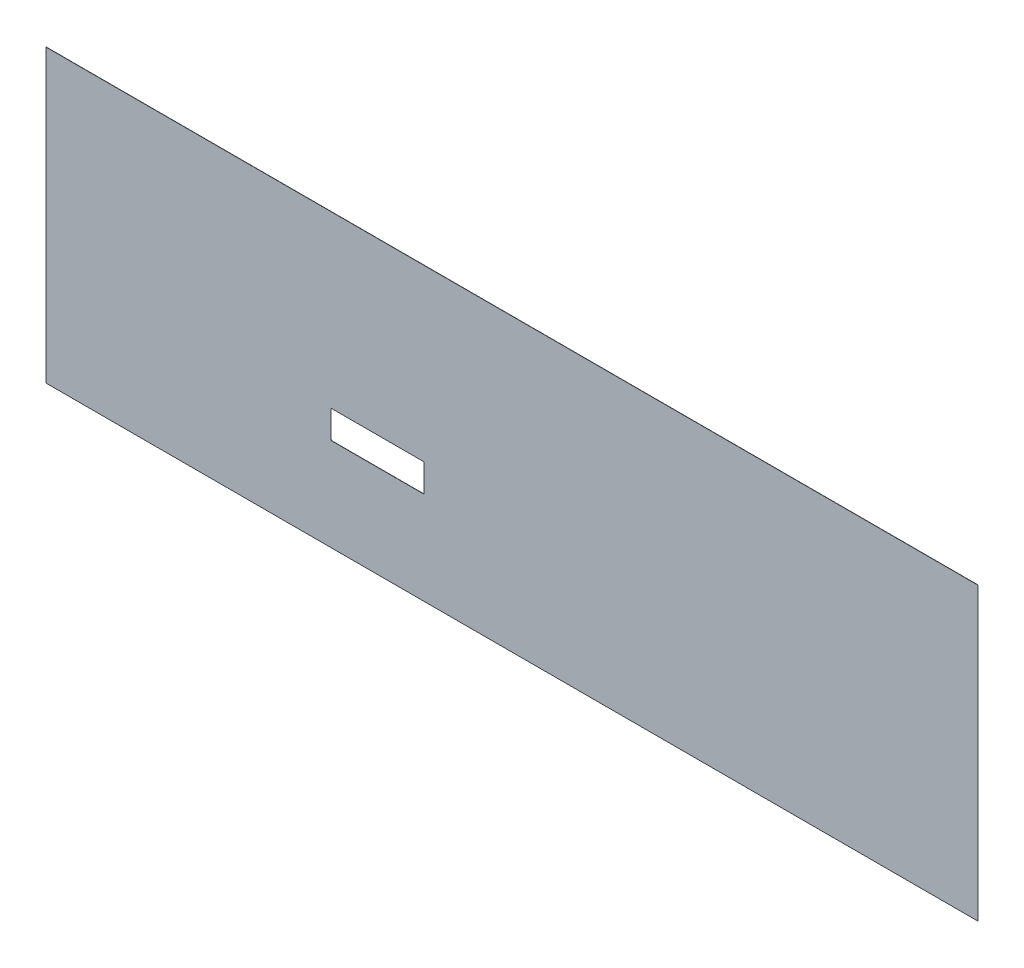
ISO-10303-21;
HEADER;
FILE_DESCRIPTION(('STEP AP214'),'2;1');
FILE_NAME('part.step','',(''),(''),'','','');
FILE_SCHEMA(('AUTOMOTIVE_DESIGN { 1 0 10303 214 1 1 1 1 }'));
ENDSEC;
DATA;
#1=APPLICATION_CONTEXT('core data for automotive mechanical design processes');
#2=APPLICATION_PROTOCOL_DEFINITION('international standard','automotive_design',2000,#1);
#3=PRODUCT_CONTEXT('',#1,'mechanical');
#4=PRODUCT('Part','Part','',(#3));
#5=PRODUCT_RELATED_PRODUCT_CATEGORY('part','',(#4));
#6=PRODUCT_DEFINITION_FORMATION('','',#4);
#7=PRODUCT_DEFINITION_CONTEXT('part definition',#1,'design');
#8=PRODUCT_DEFINITION('design','',#6,#7);
#9=PRODUCT_DEFINITION_SHAPE('','',#8);
#10=(LENGTH_UNIT() NAMED_UNIT(*) SI_UNIT(.MILLI.,.METRE.));
#11=(NAMED_UNIT(*) PLANE_ANGLE_UNIT() SI_UNIT($,.RADIAN.));
#12=(NAMED_UNIT(*) SI_UNIT($,.STERADIAN.) SOLID_ANGLE_UNIT());
#13=UNCERTAINTY_MEASURE_WITH_UNIT(LENGTH_MEASURE(1.E-05),#10,'distance_accuracy_value','');
#14=(GEOMETRIC_REPRESENTATION_CONTEXT(3) GLOBAL_UNCERTAINTY_ASSIGNED_CONTEXT((#13)) GLOBAL_UNIT_ASSIGNED_CONTEXT((#10,
#11,#12)) REPRESENTATION_CONTEXT('',''));
#15=CARTESIAN_POINT('',(0.,0.,0.));
#16=DIRECTION('',(0.,0.,1.));
#17=DIRECTION('',(1.,0.,0.));
#18=AXIS2_PLACEMENT_3D('',#15,#16,#17);
#19=CARTESIAN_POINT('',(1082.675,822.35675,-14927.8169262266));
#20=DIRECTION('',(0.,0.,1.));
#21=DIRECTION('',(1.,0.,0.));
#22=AXIS2_PLACEMENT_3D('',#19,#20,#21);
#23=CYLINDRICAL_SURFACE('',#22,6.34999999999991);
#24=CARTESIAN_POINT('',(1082.675,822.35675,-8281.9875));
#25=DIRECTION('',(0.,0.,-1.));
#26=DIRECTION('',(-1.,0.,0.));
#27=AXIS2_PLACEMENT_3D('',#24,#25,#26);
#28=CIRCLE('',#27,6.34999999999991);
#29=CARTESIAN_POINT('',(1082.675,828.70675,-8281.9875));
#30=VERTEX_POINT('',#29);
#31=CARTESIAN_POINT('',(1076.325,822.35675,-8281.9875));
#32=VERTEX_POINT('',#31);
#33=EDGE_CURVE('E137',#30,#32,#28,.F.);
#34=ORIENTED_EDGE('',*,*,#33,.F.);
#35=DIRECTION('',(0.,0.,1.));
#36=VECTOR('',#35,1.);
#37=CARTESIAN_POINT('',(1082.675,828.70675,-14927.8169262266));
#38=LINE('',#37,#36);
#39=CARTESIAN_POINT('',(1082.675,828.70675,-8280.4));
#40=VERTEX_POINT('',#39);
#41=EDGE_CURVE('E133',#30,#40,#38,.T.);
#42=ORIENTED_EDGE('',*,*,#41,.T.);
#43=CARTESIAN_POINT('',(1082.675,822.35675,-8280.4));
#44=DIRECTION('',(0.,0.,1.));
#45=DIRECTION('',(1.,0.,0.));
#46=AXIS2_PLACEMENT_3D('',#43,#44,#45);
#47=CIRCLE('',#46,6.34999999999991);
#48=CARTESIAN_POINT('',(1076.325,822.35675,-8280.4));
#49=VERTEX_POINT('',#48);
#50=EDGE_CURVE('E172',#40,#49,#47,.T.);
#51=ORIENTED_EDGE('',*,*,#50,.T.);
#52=DIRECTION('',(0.,0.,1.));
#53=VECTOR('',#52,1.);
#54=CARTESIAN_POINT('',(1076.325,822.35675,-14927.8169262266));
#55=LINE('',#54,#53);
#56=EDGE_CURVE('E169',#32,#49,#55,.T.);
#57=ORIENTED_EDGE('',*,*,#56,.F.);
#58=EDGE_LOOP('',(#34,#42,#51,#57));
#59=FACE_BOUND('',#58,.T.);
#60=ADVANCED_FACE('F32',(#59),#23,.F.);
#61=CARTESIAN_POINT('',(1076.325,0.,-14927.8169262266));
#62=DIRECTION('',(-1.,0.,0.));
#63=DIRECTION('',(0.,0.,1.));
#64=AXIS2_PLACEMENT_3D('',#61,#62,#63);
#65=PLANE('',#64);
#66=DIRECTION('',(0.,-1.,0.));
#67=VECTOR('',#66,1.);
#68=CARTESIAN_POINT('',(1076.325,0.,-8281.9875));
#69=LINE('',#68,#67);
#70=CARTESIAN_POINT('',(1076.325,644.55675,-8281.9875));
#71=VERTEX_POINT('',#70);
#72=EDGE_CURVE('E155',#32,#71,#69,.T.);
#73=ORIENTED_EDGE('',*,*,#72,.F.);
#74=ORIENTED_EDGE('',*,*,#56,.T.);
#75=DIRECTION('',(0.,-1.,0.));
#76=VECTOR('',#75,1.);
#77=CARTESIAN_POINT('',(1076.325,0.,-8280.4));
#78=LINE('',#77,#76);
#79=CARTESIAN_POINT('',(1076.325,644.55675,-8280.4));
#80=VERTEX_POINT('',#79);
#81=EDGE_CURVE('E171',#49,#80,#78,.T.);
#82=ORIENTED_EDGE('',*,*,#81,.T.);
#83=DIRECTION('',(0.,0.,1.));
#84=VECTOR('',#83,1.);
#85=CARTESIAN_POINT('',(1076.325,644.55675,-14927.8169262266));
#86=LINE('',#85,#84);
#87=EDGE_CURVE('E173',#71,#80,#86,.T.);
#88=ORIENTED_EDGE('',*,*,#87,.F.);
#89=EDGE_LOOP('',(#73,#74,#82,#88));
#90=FACE_BOUND('',#89,.T.);
#91=ADVANCED_FACE('F223',(#90),#65,.F.);
#92=CARTESIAN_POINT('',(1082.675,644.55675,-14927.8169262266));
#93=DIRECTION('',(0.,0.,1.));
#94=DIRECTION('',(1.,0.,0.));
#95=AXIS2_PLACEMENT_3D('',#92,#93,#94);
#96=CYLINDRICAL_SURFACE('',#95,6.34999999999991);
#97=CARTESIAN_POINT('',(1082.675,644.55675,-8281.9875));
#98=DIRECTION('',(0.,0.,-1.));
#99=DIRECTION('',(-1.,0.,0.));
#100=AXIS2_PLACEMENT_3D('',#97,#98,#99);
#101=CIRCLE('',#100,6.34999999999991);
#102=CARTESIAN_POINT('',(1082.675,638.20675,-8281.9875));
#103=VERTEX_POINT('',#102);
#104=EDGE_CURVE('E152',#71,#103,#101,.F.);
#105=ORIENTED_EDGE('',*,*,#104,.F.);
#106=ORIENTED_EDGE('',*,*,#87,.T.);
#107=CARTESIAN_POINT('',(1082.675,644.55675,-8280.4));
#108=DIRECTION('',(0.,0.,1.));
#109=DIRECTION('',(1.,0.,0.));
#110=AXIS2_PLACEMENT_3D('',#107,#108,#109);
#111=CIRCLE('',#110,6.34999999999991);
#112=CARTESIAN_POINT('',(1082.675,638.20675,-8280.4));
#113=VERTEX_POINT('',#112);
#114=EDGE_CURVE('E175',#80,#113,#111,.T.);
#115=ORIENTED_EDGE('',*,*,#114,.T.);
#116=DIRECTION('',(0.,0.,1.));
#117=VECTOR('',#116,1.);
#118=CARTESIAN_POINT('',(1082.675,638.20675,-14927.8169262266));
#119=LINE('',#118,#117);
#120=EDGE_CURVE('E176',#103,#113,#119,.T.);
#121=ORIENTED_EDGE('',*,*,#120,.F.);
#122=EDGE_LOOP('',(#105,#106,#115,#121));
#123=FACE_BOUND('',#122,.T.);
#124=ADVANCED_FACE('F232',(#123),#96,.F.);
#125=CARTESIAN_POINT('',(1.13860168459134E-13,638.20675,-14927.8169262266));
#126=DIRECTION('',(0.,-1.,0.));
#127=DIRECTION('',(1.,0.,0.));
#128=AXIS2_PLACEMENT_3D('',#125,#126,#127);
#129=PLANE('',#128);
#130=DIRECTION('',(1.,0.,0.));
#131=VECTOR('',#130,1.);
#132=CARTESIAN_POINT('',(1.13860168459134E-13,638.20675,-8281.9875));
#133=LINE('',#132,#131);
#134=CARTESIAN_POINT('',(1704.975,638.20675,-8281.9875));
#135=VERTEX_POINT('',#134);
#136=EDGE_CURVE('E147',#103,#135,#133,.T.);
#137=ORIENTED_EDGE('',*,*,#136,.F.);
#138=ORIENTED_EDGE('',*,*,#120,.T.);
#139=DIRECTION('',(1.,0.,0.));
#140=VECTOR('',#139,1.);
#141=CARTESIAN_POINT('',(1.13860168459134E-13,638.20675,-8280.4));
#142=LINE('',#141,#140);
#143=CARTESIAN_POINT('',(1704.975,638.20675,-8280.4));
#144=VERTEX_POINT('',#143);
#145=EDGE_CURVE('E178',#113,#144,#142,.T.);
#146=ORIENTED_EDGE('',*,*,#145,.T.);
#147=DIRECTION('',(0.,0.,1.));
#148=VECTOR('',#147,1.);
#149=CARTESIAN_POINT('',(1704.975,638.20675,-14927.8169262266));
#150=LINE('',#149,#148);
#151=EDGE_CURVE('E179',#135,#144,#150,.T.);
#152=ORIENTED_EDGE('',*,*,#151,.F.);
#153=EDGE_LOOP('',(#137,#138,#146,#152));
#154=FACE_BOUND('',#153,.T.);
#155=ADVANCED_FACE('F240',(#154),#129,.F.);
#156=CARTESIAN_POINT('',(1704.975,644.55675,-14927.8169262266));
#157=DIRECTION('',(0.,0.,1.));
#158=DIRECTION('',(1.,0.,0.));
#159=AXIS2_PLACEMENT_3D('',#156,#157,#158);
#160=CYLINDRICAL_SURFACE('',#159,6.34999999999997);
#161=CARTESIAN_POINT('',(1704.975,644.55675,-8281.9875));
#162=DIRECTION('',(0.,0.,-1.));
#163=DIRECTION('',(-1.,0.,0.));
#164=AXIS2_PLACEMENT_3D('',#161,#162,#163);
#165=CIRCLE('',#164,6.34999999999997);
#166=CARTESIAN_POINT('',(1711.325,644.55675,-8281.9875));
#167=VERTEX_POINT('',#166);
#168=EDGE_CURVE('E143',#135,#167,#165,.F.);
#169=ORIENTED_EDGE('',*,*,#168,.F.);
#170=ORIENTED_EDGE('',*,*,#151,.T.);
#171=CARTESIAN_POINT('',(1704.975,644.55675,-8280.4));
#172=DIRECTION('',(0.,0.,1.));
#173=DIRECTION('',(1.,0.,0.));
#174=AXIS2_PLACEMENT_3D('',#171,#172,#173);
#175=CIRCLE('',#174,6.34999999999997);
#176=CARTESIAN_POINT('',(1711.325,644.55675,-8280.4));
#177=VERTEX_POINT('',#176);
#178=EDGE_CURVE('E181',#144,#177,#175,.T.);
#179=ORIENTED_EDGE('',*,*,#178,.T.);
#180=DIRECTION('',(0.,0.,1.));
#181=VECTOR('',#180,1.);
#182=CARTESIAN_POINT('',(1711.325,644.55675,-14927.8169262266));
#183=LINE('',#182,#181);
#184=EDGE_CURVE('E182',#167,#177,#183,.T.);
#185=ORIENTED_EDGE('',*,*,#184,.F.);
#186=EDGE_LOOP('',(#169,#170,#179,#185));
#187=FACE_BOUND('',#186,.T.);
#188=ADVANCED_FACE('F237',(#187),#160,.F.);
#189=CARTESIAN_POINT('',(1711.325,0.,-14927.8169262266));
#190=DIRECTION('',(1.,0.,0.));
#191=DIRECTION('',(0.,0.,-1.));
#192=AXIS2_PLACEMENT_3D('',#189,#190,#191);
#193=PLANE('',#192);
#194=DIRECTION('',(0.,1.,0.));
#195=VECTOR('',#194,1.);
#196=CARTESIAN_POINT('',(1711.325,0.,-8281.9875));
#197=LINE('',#196,#195);
#198=CARTESIAN_POINT('',(1711.325,822.35675,-8281.9875));
#199=VERTEX_POINT('',#198);
#200=EDGE_CURVE('E42',#167,#199,#197,.T.);
#201=ORIENTED_EDGE('',*,*,#200,.F.);
#202=ORIENTED_EDGE('',*,*,#184,.T.);
#203=DIRECTION('',(0.,1.,0.));
#204=VECTOR('',#203,1.);
#205=CARTESIAN_POINT('',(1711.325,0.,-8280.4));
#206=LINE('',#205,#204);
#207=CARTESIAN_POINT('',(1711.325,822.35675,-8280.4));
#208=VERTEX_POINT('',#207);
#209=EDGE_CURVE('E184',#177,#208,#206,.T.);
#210=ORIENTED_EDGE('',*,*,#209,.T.);
#211=DIRECTION('',(0.,0.,1.));
#212=VECTOR('',#211,1.);
#213=CARTESIAN_POINT('',(1711.325,822.35675,-14927.8169262266));
#214=LINE('',#213,#212);
#215=EDGE_CURVE('E185',#199,#208,#214,.T.);
#216=ORIENTED_EDGE('',*,*,#215,.F.);
#217=EDGE_LOOP('',(#201,#202,#210,#216));
#218=FACE_BOUND('',#217,.T.);
#219=ADVANCED_FACE('F235',(#218),#193,.F.);
#220=CARTESIAN_POINT('',(1704.975,822.35675,-14927.8169262266));
#221=DIRECTION('',(0.,0.,1.));
#222=DIRECTION('',(1.,0.,0.));
#223=AXIS2_PLACEMENT_3D('',#220,#221,#222);
#224=CYLINDRICAL_SURFACE('',#223,6.34999999999986);
#225=CARTESIAN_POINT('',(1704.975,822.35675,-8281.9875));
#226=DIRECTION('',(0.,0.,-1.));
#227=DIRECTION('',(-1.,0.,0.));
#228=AXIS2_PLACEMENT_3D('',#225,#226,#227);
#229=CIRCLE('',#228,6.34999999999986);
#230=CARTESIAN_POINT('',(1704.975,828.70675,-8281.9875));
#231=VERTEX_POINT('',#230);
#232=EDGE_CURVE('E11',#199,#231,#229,.F.);
#233=ORIENTED_EDGE('',*,*,#232,.F.);
#234=ORIENTED_EDGE('',*,*,#215,.T.);
#235=CARTESIAN_POINT('',(1704.975,822.35675,-8280.4));
#236=DIRECTION('',(0.,0.,1.));
#237=DIRECTION('',(1.,0.,0.));
#238=AXIS2_PLACEMENT_3D('',#235,#236,#237);
#239=CIRCLE('',#238,6.34999999999986);
#240=CARTESIAN_POINT('',(1704.975,828.70675,-8280.4));
#241=VERTEX_POINT('',#240);
#242=EDGE_CURVE('E122',#208,#241,#239,.T.);
#243=ORIENTED_EDGE('',*,*,#242,.T.);
#244=DIRECTION('',(0.,0.,1.));
#245=VECTOR('',#244,1.);
#246=CARTESIAN_POINT('',(1704.975,828.70675,-14927.8169262266));
#247=LINE('',#246,#245);
#248=EDGE_CURVE('E117',#231,#241,#247,.T.);
#249=ORIENTED_EDGE('',*,*,#248,.F.);
#250=EDGE_LOOP('',(#233,#234,#243,#249));
#251=FACE_BOUND('',#250,.T.);
#252=ADVANCED_FACE('F119',(#251),#224,.F.);
#253=CARTESIAN_POINT('',(0.,6.38175,-14927.8169262266));
#254=DIRECTION('',(0.,-1.,0.));
#255=DIRECTION('',(0.,0.,-1.));
#256=AXIS2_PLACEMENT_3D('',#253,#254,#255);
#257=PLANE('',#256);
#258=DIRECTION('',(0.,0.,1.));
#259=VECTOR('',#258,1.);
#260=CARTESIAN_POINT('',(-863.6,6.38175,-14927.8169262266));
#261=LINE('',#260,#259);
#262=CARTESIAN_POINT('',(-863.6,6.38175,-8281.9875));
#263=VERTEX_POINT('',#262);
#264=CARTESIAN_POINT('',(-863.6,6.38175,-8280.4));
#265=VERTEX_POINT('',#264);
#266=EDGE_CURVE('E164',#263,#265,#261,.T.);
#267=ORIENTED_EDGE('',*,*,#266,.F.);
#268=DIRECTION('',(1.,0.,0.));
#269=VECTOR('',#268,1.);
#270=CARTESIAN_POINT('',(0.,6.38175,-8281.9875));
#271=LINE('',#270,#269);
#272=CARTESIAN_POINT('',(5480.05,6.38175,-8281.9875));
#273=VERTEX_POINT('',#272);
#274=EDGE_CURVE('E159',#263,#273,#271,.T.);
#275=ORIENTED_EDGE('',*,*,#274,.T.);
#276=DIRECTION('',(0.,0.,1.));
#277=VECTOR('',#276,1.);
#278=CARTESIAN_POINT('',(5480.05,6.38175,-14927.8169262266));
#279=LINE('',#278,#277);
#280=CARTESIAN_POINT('',(5480.05,6.38175,-8280.4));
#281=VERTEX_POINT('',#280);
#282=EDGE_CURVE('E36',#273,#281,#279,.T.);
#283=ORIENTED_EDGE('',*,*,#282,.T.);
#284=DIRECTION('',(1.,0.,0.));
#285=VECTOR('',#284,1.);
#286=CARTESIAN_POINT('',(0.,6.38175,-8280.4));
#287=LINE('',#286,#285);
#288=EDGE_CURVE('E195',#265,#281,#287,.T.);
#289=ORIENTED_EDGE('',*,*,#288,.F.);
#290=EDGE_LOOP('',(#267,#275,#283,#289));
#291=FACE_BOUND('',#290,.T.);
#292=ADVANCED_FACE('F287',(#291),#257,.T.);
#293=CARTESIAN_POINT('',(-863.6,0.,-14927.8169262266));
#294=DIRECTION('',(-1.,0.,0.));
#295=DIRECTION('',(0.,0.,1.));
#296=AXIS2_PLACEMENT_3D('',#293,#294,#295);
#297=PLANE('',#296);
#298=DIRECTION('',(0.,0.,1.));
#299=VECTOR('',#298,1.);
#300=CARTESIAN_POINT('',(-863.6,1987.58175,-14927.8169262266));
#301=LINE('',#300,#299);
#302=CARTESIAN_POINT('',(-863.6,1987.58175,-8281.9875));
#303=VERTEX_POINT('',#302);
#304=CARTESIAN_POINT('',(-863.6,1987.58175,-8280.4));
#305=VERTEX_POINT('',#304);
#306=EDGE_CURVE('E167',#303,#305,#301,.T.);
#307=ORIENTED_EDGE('',*,*,#306,.F.);
#308=DIRECTION('',(0.,-1.,0.));
#309=VECTOR('',#308,1.);
#310=CARTESIAN_POINT('',(-863.6,0.,-8281.9875));
#311=LINE('',#310,#309);
#312=EDGE_CURVE('E161',#303,#263,#311,.T.);
#313=ORIENTED_EDGE('',*,*,#312,.T.);
#314=ORIENTED_EDGE('',*,*,#266,.T.);
#315=DIRECTION('',(0.,-1.,0.));
#316=VECTOR('',#315,1.);
#317=CARTESIAN_POINT('',(-863.6,0.,-8280.4));
#318=LINE('',#317,#316);
#319=EDGE_CURVE('E138',#305,#265,#318,.T.);
#320=ORIENTED_EDGE('',*,*,#319,.F.);
#321=EDGE_LOOP('',(#307,#313,#314,#320));
#322=FACE_BOUND('',#321,.T.);
#323=ADVANCED_FACE('F297',(#322),#297,.T.);
#324=CARTESIAN_POINT('',(0.,1987.58175,-14927.8169262266));
#325=DIRECTION('',(0.,1.,0.));
#326=DIRECTION('',(0.,0.,1.));
#327=AXIS2_PLACEMENT_3D('',#324,#325,#326);
#328=PLANE('',#327);
#329=DIRECTION('',(0.,0.,1.));
#330=VECTOR('',#329,1.);
#331=CARTESIAN_POINT('',(5480.05,1987.58175,-14927.8169262266));
#332=LINE('',#331,#330);
#333=CARTESIAN_POINT('',(5480.05,1987.58175,-8281.9875));
#334=VERTEX_POINT('',#333);
#335=CARTESIAN_POINT('',(5480.05,1987.58175,-8280.4));
#336=VERTEX_POINT('',#335);
#337=EDGE_CURVE('E127',#334,#336,#332,.T.);
#338=ORIENTED_EDGE('',*,*,#337,.F.);
#339=DIRECTION('',(-1.,0.,0.));
#340=VECTOR('',#339,1.);
#341=CARTESIAN_POINT('',(0.,1987.58175,-8281.9875));
#342=LINE('',#341,#340);
#343=EDGE_CURVE('E165',#334,#303,#342,.T.);
#344=ORIENTED_EDGE('',*,*,#343,.T.);
#345=ORIENTED_EDGE('',*,*,#306,.T.);
#346=DIRECTION('',(-1.,0.,0.));
#347=VECTOR('',#346,1.);
#348=CARTESIAN_POINT('',(0.,1987.58175,-8280.4));
#349=LINE('',#348,#347);
#350=EDGE_CURVE('E201',#336,#305,#349,.T.);
#351=ORIENTED_EDGE('',*,*,#350,.F.);
#352=EDGE_LOOP('',(#338,#344,#345,#351));
#353=FACE_BOUND('',#352,.T.);
#354=ADVANCED_FACE('F309',(#353),#328,.T.);
#355=CARTESIAN_POINT('',(5480.05,0.,-14927.8169262266));
#356=DIRECTION('',(1.,0.,0.));
#357=DIRECTION('',(0.,0.,-1.));
#358=AXIS2_PLACEMENT_3D('',#355,#356,#357);
#359=PLANE('',#358);
#360=ORIENTED_EDGE('',*,*,#282,.F.);
#361=DIRECTION('',(0.,1.,0.));
#362=VECTOR('',#361,1.);
#363=CARTESIAN_POINT('',(5480.05,0.,-8281.9875));
#364=LINE('',#363,#362);
#365=EDGE_CURVE('E50',#273,#334,#364,.T.);
#366=ORIENTED_EDGE('',*,*,#365,.T.);
#367=ORIENTED_EDGE('',*,*,#337,.T.);
#368=DIRECTION('',(0.,1.,0.));
#369=VECTOR('',#368,1.);
#370=CARTESIAN_POINT('',(5480.05,0.,-8280.4));
#371=LINE('',#370,#369);
#372=EDGE_CURVE('E198',#281,#336,#371,.T.);
#373=ORIENTED_EDGE('',*,*,#372,.F.);
#374=EDGE_LOOP('',(#360,#366,#367,#373));
#375=FACE_BOUND('',#374,.T.);
#376=ADVANCED_FACE('F320',(#375),#359,.T.);
#377=CARTESIAN_POINT('',(1.47846587580312E-13,828.70675,-14927.8169262266));
#378=DIRECTION('',(0.,1.,0.));
#379=DIRECTION('',(-1.,0.,0.));
#380=AXIS2_PLACEMENT_3D('',#377,#378,#379);
#381=PLANE('',#380);
#382=DIRECTION('',(-1.,0.,0.));
#383=VECTOR('',#382,1.);
#384=CARTESIAN_POINT('',(1.47846587580312E-13,828.70675,-8281.9875));
#385=LINE('',#384,#383);
#386=EDGE_CURVE('E131',#231,#30,#385,.T.);
#387=ORIENTED_EDGE('',*,*,#386,.F.);
#388=ORIENTED_EDGE('',*,*,#248,.T.);
#389=DIRECTION('',(-1.,0.,0.));
#390=VECTOR('',#389,1.);
#391=CARTESIAN_POINT('',(1.47846587580312E-13,828.70675,-8280.4));
#392=LINE('',#391,#390);
#393=EDGE_CURVE('E126',#241,#40,#392,.T.);
#394=ORIENTED_EDGE('',*,*,#393,.T.);
#395=ORIENTED_EDGE('',*,*,#41,.F.);
#396=EDGE_LOOP('',(#387,#388,#394,#395));
#397=FACE_BOUND('',#396,.T.);
#398=ADVANCED_FACE('F132',(#397),#381,.F.);
#399=CARTESIAN_POINT('',(0.,0.,-8280.4));
#400=DIRECTION('',(0.,0.,1.));
#401=DIRECTION('',(1.,0.,0.));
#402=AXIS2_PLACEMENT_3D('',#399,#400,#401);
#403=PLANE('',#402);
#404=ORIENTED_EDGE('',*,*,#288,.T.);
#405=ORIENTED_EDGE('',*,*,#372,.T.);
#406=ORIENTED_EDGE('',*,*,#350,.T.);
#407=ORIENTED_EDGE('',*,*,#319,.T.);
#408=EDGE_LOOP('',(#404,#405,#406,#407));
#409=FACE_BOUND('',#408,.T.);
#410=ORIENTED_EDGE('',*,*,#50,.F.);
#411=ORIENTED_EDGE('',*,*,#393,.F.);
#412=ORIENTED_EDGE('',*,*,#242,.F.);
#413=ORIENTED_EDGE('',*,*,#209,.F.);
#414=ORIENTED_EDGE('',*,*,#178,.F.);
#415=ORIENTED_EDGE('',*,*,#145,.F.);
#416=ORIENTED_EDGE('',*,*,#114,.F.);
#417=ORIENTED_EDGE('',*,*,#81,.F.);
#418=EDGE_LOOP('',(#410,#411,#412,#413,#414,#415,#416,#417));
#419=FACE_BOUND('',#418,.T.);
#420=ADVANCED_FACE('F228',(#409,#419),#403,.T.);
#421=CARTESIAN_POINT('',(5467.35,923.95675,-8281.9875));
#422=DIRECTION('',(0.,0.,-1.));
#423=DIRECTION('',(-1.,0.,0.));
#424=AXIS2_PLACEMENT_3D('',#421,#422,#423);
#425=PLANE('',#424);
#426=ORIENTED_EDGE('',*,*,#274,.F.);
#427=ORIENTED_EDGE('',*,*,#312,.F.);
#428=ORIENTED_EDGE('',*,*,#343,.F.);
#429=ORIENTED_EDGE('',*,*,#365,.F.);
#430=EDGE_LOOP('',(#426,#427,#428,#429));
#431=FACE_BOUND('',#430,.T.);
#432=ORIENTED_EDGE('',*,*,#386,.T.);
#433=ORIENTED_EDGE('',*,*,#33,.T.);
#434=ORIENTED_EDGE('',*,*,#72,.T.);
#435=ORIENTED_EDGE('',*,*,#104,.T.);
#436=ORIENTED_EDGE('',*,*,#136,.T.);
#437=ORIENTED_EDGE('',*,*,#168,.T.);
#438=ORIENTED_EDGE('',*,*,#200,.T.);
#439=ORIENTED_EDGE('',*,*,#232,.T.);
#440=EDGE_LOOP('',(#432,#433,#434,#435,#436,#437,#438,#439));
#441=FACE_BOUND('',#440,.T.);
#442=ADVANCED_FACE('F34',(#431,#441),#425,.T.);
#443=CLOSED_SHELL('',(#60,#91,#124,#155,#188,#219,#252,#292,#323,#354,#376,#398,#420,#442));
#444=MANIFOLD_SOLID_BREP('B2',#443);
#445=ADVANCED_BREP_SHAPE_REPRESENTATION('',(#18,#444),#14);
#446=SHAPE_DEFINITION_REPRESENTATION(#9,#445);
ENDSEC;
END-ISO-10303-21;
